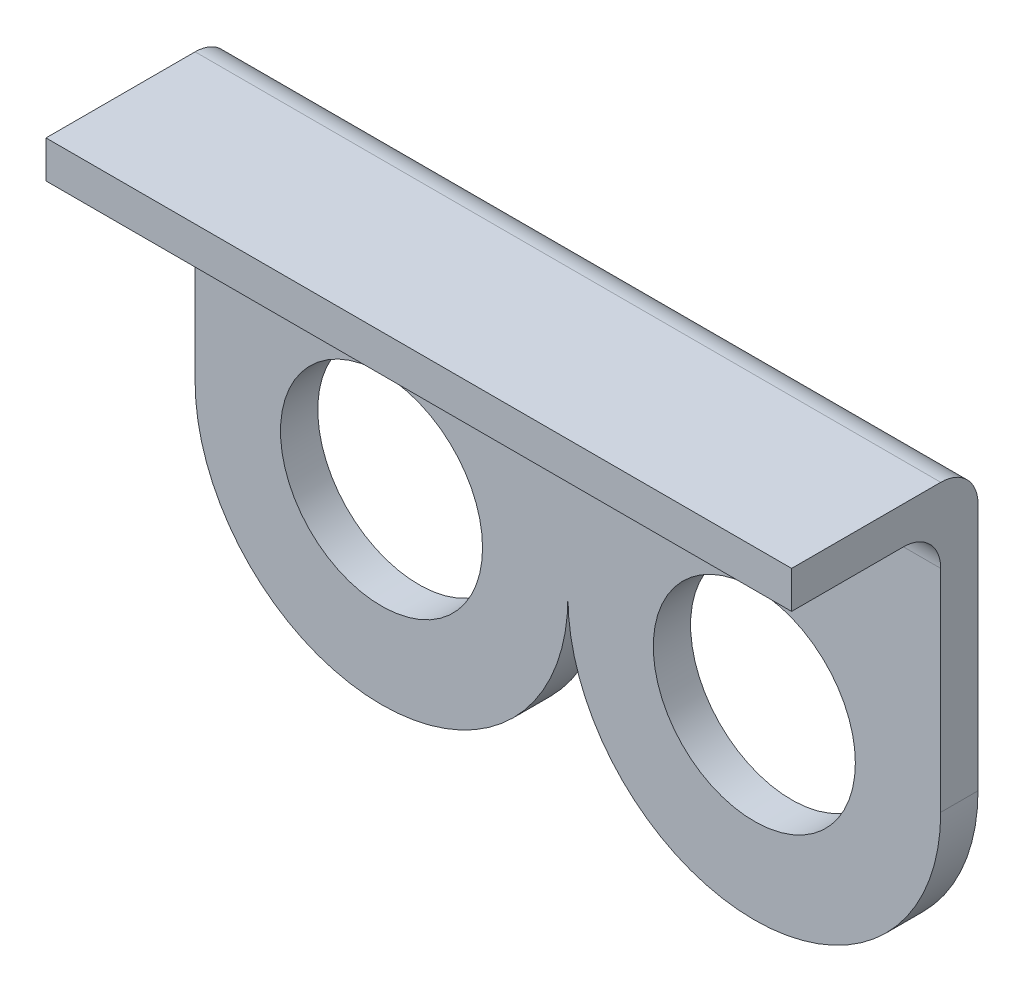
ISO-10303-21;
HEADER;
FILE_DESCRIPTION(('STEP AP214'),'2;1');
FILE_NAME('part.step','',(''),(''),'','','');
FILE_SCHEMA(('AUTOMOTIVE_DESIGN { 1 0 10303 214 1 1 1 1 }'));
ENDSEC;
DATA;
#1=APPLICATION_CONTEXT('core data for automotive mechanical design processes');
#2=APPLICATION_PROTOCOL_DEFINITION('international standard','automotive_design',2000,#1);
#3=PRODUCT_CONTEXT('',#1,'mechanical');
#4=PRODUCT('Part','Part','',(#3));
#5=PRODUCT_RELATED_PRODUCT_CATEGORY('part','',(#4));
#6=PRODUCT_DEFINITION_FORMATION('','',#4);
#7=PRODUCT_DEFINITION_CONTEXT('part definition',#1,'design');
#8=PRODUCT_DEFINITION('design','',#6,#7);
#9=PRODUCT_DEFINITION_SHAPE('','',#8);
#10=(LENGTH_UNIT() NAMED_UNIT(*) SI_UNIT(.MILLI.,.METRE.));
#11=(NAMED_UNIT(*) PLANE_ANGLE_UNIT() SI_UNIT($,.RADIAN.));
#12=(NAMED_UNIT(*) SI_UNIT($,.STERADIAN.) SOLID_ANGLE_UNIT());
#13=UNCERTAINTY_MEASURE_WITH_UNIT(LENGTH_MEASURE(1.E-05),#10,'distance_accuracy_value','');
#14=(GEOMETRIC_REPRESENTATION_CONTEXT(3) GLOBAL_UNCERTAINTY_ASSIGNED_CONTEXT((#13)) GLOBAL_UNIT_ASSIGNED_CONTEXT((#10,
#11,#12)) REPRESENTATION_CONTEXT('',''));
#15=CARTESIAN_POINT('',(0.,0.,0.));
#16=DIRECTION('',(0.,0.,1.));
#17=DIRECTION('',(1.,0.,0.));
#18=AXIS2_PLACEMENT_3D('',#15,#16,#17);
#19=CARTESIAN_POINT('',(-30.,20.5,15.));
#20=DIRECTION('',(0.,1.,0.));
#21=DIRECTION('',(0.,0.,1.));
#22=AXIS2_PLACEMENT_3D('',#19,#20,#21);
#23=PLANE('',#22);
#24=DIRECTION('',(0.,0.,-1.));
#25=VECTOR('',#24,1.);
#26=CARTESIAN_POINT('',(30.,20.5,15.));
#27=LINE('',#26,#25);
#28=CARTESIAN_POINT('',(30.,20.5,15.));
#29=VERTEX_POINT('',#28);
#30=CARTESIAN_POINT('',(30.,20.5,3.));
#31=VERTEX_POINT('',#30);
#32=EDGE_CURVE('E187',#29,#31,#27,.T.);
#33=ORIENTED_EDGE('',*,*,#32,.T.);
#34=DIRECTION('',(1.,0.,0.));
#35=VECTOR('',#34,1.);
#36=CARTESIAN_POINT('',(-30.,20.5,3.));
#37=LINE('',#36,#35);
#38=CARTESIAN_POINT('',(-30.,20.5,3.));
#39=VERTEX_POINT('',#38);
#40=EDGE_CURVE('E48',#31,#39,#37,.F.);
#41=ORIENTED_EDGE('',*,*,#40,.T.);
#42=DIRECTION('',(0.,0.,-1.));
#43=VECTOR('',#42,1.);
#44=CARTESIAN_POINT('',(-30.,20.5,15.));
#45=LINE('',#44,#43);
#46=CARTESIAN_POINT('',(-30.,20.5,15.));
#47=VERTEX_POINT('',#46);
#48=EDGE_CURVE('E193',#47,#39,#45,.T.);
#49=ORIENTED_EDGE('',*,*,#48,.F.);
#50=DIRECTION('',(1.,0.,0.));
#51=VECTOR('',#50,1.);
#52=CARTESIAN_POINT('',(-30.,20.5,15.));
#53=LINE('',#52,#51);
#54=EDGE_CURVE('E172',#47,#29,#53,.T.);
#55=ORIENTED_EDGE('',*,*,#54,.T.);
#56=EDGE_LOOP('',(#33,#41,#49,#55));
#57=FACE_BOUND('',#56,.T.);
#58=ADVANCED_FACE('F39',(#57),#23,.T.);
#59=CARTESIAN_POINT('',(-30.,17.5,15.));
#60=DIRECTION('',(-1.,0.,0.));
#61=DIRECTION('',(0.,0.,1.));
#62=AXIS2_PLACEMENT_3D('',#59,#60,#61);
#63=PLANE('',#62);
#64=ORIENTED_EDGE('',*,*,#48,.T.);
#65=CARTESIAN_POINT('',(-30.,17.5,3.));
#66=DIRECTION('',(-1.,0.,0.));
#67=DIRECTION('',(0.,0.,1.));
#68=AXIS2_PLACEMENT_3D('',#65,#66,#67);
#69=CIRCLE('',#68,3.);
#70=CARTESIAN_POINT('',(-30.,17.5,0.));
#71=VERTEX_POINT('',#70);
#72=EDGE_CURVE('E11',#39,#71,#69,.T.);
#73=ORIENTED_EDGE('',*,*,#72,.T.);
#74=DIRECTION('',(0.,1.,0.));
#75=VECTOR('',#74,1.);
#76=CARTESIAN_POINT('',(-30.,17.5,0.));
#77=LINE('',#76,#75);
#78=CARTESIAN_POINT('',(-30.,-2.50000000000001,0.));
#79=VERTEX_POINT('',#78);
#80=EDGE_CURVE('E177',#79,#71,#77,.T.);
#81=ORIENTED_EDGE('',*,*,#80,.F.);
#82=DIRECTION('',(0.,0.,-1.));
#83=VECTOR('',#82,1.);
#84=CARTESIAN_POINT('',(-30.,-2.50000000000001,3.));
#85=LINE('',#84,#83);
#86=CARTESIAN_POINT('',(-30.,-2.50000000000001,3.));
#87=VERTEX_POINT('',#86);
#88=EDGE_CURVE('E130',#87,#79,#85,.T.);
#89=ORIENTED_EDGE('',*,*,#88,.F.);
#90=DIRECTION('',(0.,-1.,0.));
#91=VECTOR('',#90,1.);
#92=CARTESIAN_POINT('',(-30.,0.,3.));
#93=LINE('',#92,#91);
#94=CARTESIAN_POINT('',(-30.,14.5,3.));
#95=VERTEX_POINT('',#94);
#96=EDGE_CURVE('E120',#95,#87,#93,.T.);
#97=ORIENTED_EDGE('',*,*,#96,.F.);
#98=CARTESIAN_POINT('',(-30.,14.5,6.));
#99=DIRECTION('',(-1.,0.,0.));
#100=DIRECTION('',(0.,0.,1.));
#101=AXIS2_PLACEMENT_3D('',#98,#99,#100);
#102=CIRCLE('',#101,3.);
#103=CARTESIAN_POINT('',(-30.,17.5,6.));
#104=VERTEX_POINT('',#103);
#105=EDGE_CURVE('E214',#95,#104,#102,.F.);
#106=ORIENTED_EDGE('',*,*,#105,.T.);
#107=DIRECTION('',(0.,0.,-1.));
#108=VECTOR('',#107,1.);
#109=CARTESIAN_POINT('',(-30.,17.5,15.));
#110=LINE('',#109,#108);
#111=CARTESIAN_POINT('',(-30.,17.5,15.));
#112=VERTEX_POINT('',#111);
#113=EDGE_CURVE('E197',#112,#104,#110,.T.);
#114=ORIENTED_EDGE('',*,*,#113,.F.);
#115=DIRECTION('',(0.,1.,0.));
#116=VECTOR('',#115,1.);
#117=CARTESIAN_POINT('',(-30.,17.5,15.));
#118=LINE('',#117,#116);
#119=EDGE_CURVE('E183',#112,#47,#118,.T.);
#120=ORIENTED_EDGE('',*,*,#119,.T.);
#121=EDGE_LOOP('',(#64,#73,#81,#89,#97,#106,#114,#120));
#122=FACE_BOUND('',#121,.T.);
#123=ADVANCED_FACE('F231',(#122),#63,.T.);
#124=CARTESIAN_POINT('',(-30.,17.5,15.));
#125=DIRECTION('',(0.,1.,0.));
#126=DIRECTION('',(0.,0.,1.));
#127=AXIS2_PLACEMENT_3D('',#124,#125,#126);
#128=PLANE('',#127);
#129=ORIENTED_EDGE('',*,*,#113,.T.);
#130=DIRECTION('',(1.,0.,0.));
#131=VECTOR('',#130,1.);
#132=CARTESIAN_POINT('',(-30.,17.5,6.));
#133=LINE('',#132,#131);
#134=CARTESIAN_POINT('',(30.,17.5,6.));
#135=VERTEX_POINT('',#134);
#136=EDGE_CURVE('E196',#104,#135,#133,.T.);
#137=ORIENTED_EDGE('',*,*,#136,.T.);
#138=DIRECTION('',(0.,0.,-1.));
#139=VECTOR('',#138,1.);
#140=CARTESIAN_POINT('',(30.,17.5,15.));
#141=LINE('',#140,#139);
#142=CARTESIAN_POINT('',(30.,17.5,15.));
#143=VERTEX_POINT('',#142);
#144=EDGE_CURVE('E201',#143,#135,#141,.T.);
#145=ORIENTED_EDGE('',*,*,#144,.F.);
#146=DIRECTION('',(1.,0.,0.));
#147=VECTOR('',#146,1.);
#148=CARTESIAN_POINT('',(-30.,17.5,15.));
#149=LINE('',#148,#147);
#150=EDGE_CURVE('E180',#112,#143,#149,.T.);
#151=ORIENTED_EDGE('',*,*,#150,.F.);
#152=EDGE_LOOP('',(#129,#137,#145,#151));
#153=FACE_BOUND('',#152,.T.);
#154=ADVANCED_FACE('F241',(#153),#128,.F.);
#155=CARTESIAN_POINT('',(30.,17.5,15.));
#156=DIRECTION('',(-1.,0.,0.));
#157=DIRECTION('',(0.,0.,1.));
#158=AXIS2_PLACEMENT_3D('',#155,#156,#157);
#159=PLANE('',#158);
#160=DIRECTION('',(0.,1.,0.));
#161=VECTOR('',#160,1.);
#162=CARTESIAN_POINT('',(30.,17.5,0.));
#163=LINE('',#162,#161);
#164=CARTESIAN_POINT('',(30.,-2.5,0.));
#165=VERTEX_POINT('',#164);
#166=CARTESIAN_POINT('',(30.,17.5,0.));
#167=VERTEX_POINT('',#166);
#168=EDGE_CURVE('E129',#165,#167,#163,.T.);
#169=ORIENTED_EDGE('',*,*,#168,.T.);
#170=CARTESIAN_POINT('',(30.,17.5,3.));
#171=DIRECTION('',(-1.,0.,0.));
#172=DIRECTION('',(0.,0.,1.));
#173=AXIS2_PLACEMENT_3D('',#170,#171,#172);
#174=CIRCLE('',#173,3.);
#175=EDGE_CURVE('E62',#167,#31,#174,.F.);
#176=ORIENTED_EDGE('',*,*,#175,.T.);
#177=ORIENTED_EDGE('',*,*,#32,.F.);
#178=DIRECTION('',(0.,1.,0.));
#179=VECTOR('',#178,1.);
#180=CARTESIAN_POINT('',(30.,17.5,15.));
#181=LINE('',#180,#179);
#182=EDGE_CURVE('E176',#143,#29,#181,.T.);
#183=ORIENTED_EDGE('',*,*,#182,.F.);
#184=ORIENTED_EDGE('',*,*,#144,.T.);
#185=CARTESIAN_POINT('',(30.,14.5,6.));
#186=DIRECTION('',(-1.,0.,0.));
#187=DIRECTION('',(0.,0.,1.));
#188=AXIS2_PLACEMENT_3D('',#185,#186,#187);
#189=CIRCLE('',#188,3.);
#190=CARTESIAN_POINT('',(30.,14.5,3.));
#191=VERTEX_POINT('',#190);
#192=EDGE_CURVE('E115',#135,#191,#189,.T.);
#193=ORIENTED_EDGE('',*,*,#192,.T.);
#194=DIRECTION('',(0.,-1.,0.));
#195=VECTOR('',#194,1.);
#196=CARTESIAN_POINT('',(30.,0.,3.));
#197=LINE('',#196,#195);
#198=CARTESIAN_POINT('',(30.,-2.5,3.));
#199=VERTEX_POINT('',#198);
#200=EDGE_CURVE('E109',#191,#199,#197,.T.);
#201=ORIENTED_EDGE('',*,*,#200,.T.);
#202=DIRECTION('',(0.,0.,-1.));
#203=VECTOR('',#202,1.);
#204=CARTESIAN_POINT('',(30.,-2.5,3.));
#205=LINE('',#204,#203);
#206=EDGE_CURVE('E112',#199,#165,#205,.T.);
#207=ORIENTED_EDGE('',*,*,#206,.T.);
#208=EDGE_LOOP('',(#169,#176,#177,#183,#184,#193,#201,#207));
#209=FACE_BOUND('',#208,.T.);
#210=ADVANCED_FACE('F111',(#209),#159,.F.);
#211=CARTESIAN_POINT('',(0.,0.,15.));
#212=DIRECTION('',(0.,0.,1.));
#213=DIRECTION('',(1.,0.,0.));
#214=AXIS2_PLACEMENT_3D('',#211,#212,#213);
#215=PLANE('',#214);
#216=ORIENTED_EDGE('',*,*,#54,.F.);
#217=ORIENTED_EDGE('',*,*,#119,.F.);
#218=ORIENTED_EDGE('',*,*,#150,.T.);
#219=ORIENTED_EDGE('',*,*,#182,.T.);
#220=EDGE_LOOP('',(#216,#217,#218,#219));
#221=FACE_BOUND('',#220,.T.);
#222=ADVANCED_FACE('F236',(#221),#215,.T.);
#223=CARTESIAN_POINT('',(0.,0.,0.));
#224=DIRECTION('',(0.,0.,1.));
#225=DIRECTION('',(1.,0.,0.));
#226=AXIS2_PLACEMENT_3D('',#223,#224,#225);
#227=PLANE('',#226);
#228=ORIENTED_EDGE('',*,*,#80,.T.);
#229=DIRECTION('',(1.,0.,0.));
#230=VECTOR('',#229,1.);
#231=CARTESIAN_POINT('',(30.,17.5,0.));
#232=LINE('',#231,#230);
#233=EDGE_CURVE('E217',#71,#167,#232,.T.);
#234=ORIENTED_EDGE('',*,*,#233,.T.);
#235=ORIENTED_EDGE('',*,*,#168,.F.);
#236=CARTESIAN_POINT('',(15.,-2.50000000000001,0.));
#237=DIRECTION('',(0.,0.,1.));
#238=DIRECTION('',(1.,0.,0.));
#239=AXIS2_PLACEMENT_3D('',#236,#237,#238);
#240=CIRCLE('',#239,15.);
#241=CARTESIAN_POINT('',(0.,-2.50000000000001,0.));
#242=VERTEX_POINT('',#241);
#243=EDGE_CURVE('E127',#165,#242,#240,.F.);
#244=ORIENTED_EDGE('',*,*,#243,.T.);
#245=CARTESIAN_POINT('',(-15.,-2.50000000000001,0.));
#246=DIRECTION('',(0.,0.,1.));
#247=DIRECTION('',(1.,0.,0.));
#248=AXIS2_PLACEMENT_3D('',#245,#246,#247);
#249=CIRCLE('',#248,15.);
#250=EDGE_CURVE('E160',#79,#242,#249,.T.);
#251=ORIENTED_EDGE('',*,*,#250,.F.);
#252=EDGE_LOOP('',(#228,#234,#235,#244,#251));
#253=FACE_BOUND('',#252,.T.);
#254=CARTESIAN_POINT('',(-15.,-2.50000000000001,0.));
#255=DIRECTION('',(0.,0.,1.));
#256=DIRECTION('',(1.,0.,0.));
#257=AXIS2_PLACEMENT_3D('',#254,#255,#256);
#258=CIRCLE('',#257,8.13);
#259=CARTESIAN_POINT('',(-6.87,-2.50000000000001,0.));
#260=VERTEX_POINT('',#259);
#261=EDGE_CURVE('E142',#260,#260,#258,.T.);
#262=ORIENTED_EDGE('',*,*,#261,.T.);
#263=EDGE_LOOP('',(#262));
#264=FACE_BOUND('',#263,.T.);
#265=CARTESIAN_POINT('',(15.,-2.50000000000001,0.));
#266=DIRECTION('',(0.,0.,1.));
#267=DIRECTION('',(1.,0.,0.));
#268=AXIS2_PLACEMENT_3D('',#265,#266,#267);
#269=CIRCLE('',#268,8.13);
#270=CARTESIAN_POINT('',(23.13,-2.50000000000001,0.));
#271=VERTEX_POINT('',#270);
#272=EDGE_CURVE('E138',#271,#271,#269,.F.);
#273=ORIENTED_EDGE('',*,*,#272,.F.);
#274=EDGE_LOOP('',(#273));
#275=FACE_BOUND('',#274,.T.);
#276=ADVANCED_FACE('F225',(#253,#264,#275),#227,.F.);
#277=CARTESIAN_POINT('',(15.,-2.50000000000001,3.));
#278=DIRECTION('',(0.,0.,-1.));
#279=DIRECTION('',(-1.,0.,0.));
#280=AXIS2_PLACEMENT_3D('',#277,#278,#279);
#281=CYLINDRICAL_SURFACE('',#280,15.);
#282=ORIENTED_EDGE('',*,*,#243,.F.);
#283=ORIENTED_EDGE('',*,*,#206,.F.);
#284=CARTESIAN_POINT('',(15.,-2.50000000000001,3.));
#285=DIRECTION('',(0.,0.,1.));
#286=DIRECTION('',(1.,0.,0.));
#287=AXIS2_PLACEMENT_3D('',#284,#285,#286);
#288=CIRCLE('',#287,15.);
#289=CARTESIAN_POINT('',(0.,-2.50000000000001,3.));
#290=VERTEX_POINT('',#289);
#291=EDGE_CURVE('E121',#199,#290,#288,.F.);
#292=ORIENTED_EDGE('',*,*,#291,.T.);
#293=DIRECTION('',(0.,0.,-1.));
#294=VECTOR('',#293,1.);
#295=CARTESIAN_POINT('',(0.,-2.50000000000001,3.));
#296=LINE('',#295,#294);
#297=EDGE_CURVE('E157',#290,#242,#296,.T.);
#298=ORIENTED_EDGE('',*,*,#297,.T.);
#299=EDGE_LOOP('',(#282,#283,#292,#298));
#300=FACE_BOUND('',#299,.T.);
#301=ADVANCED_FACE('F125',(#300),#281,.T.);
#302=CARTESIAN_POINT('',(-15.,-2.50000000000001,3.));
#303=DIRECTION('',(0.,0.,-1.));
#304=DIRECTION('',(-1.,0.,0.));
#305=AXIS2_PLACEMENT_3D('',#302,#303,#304);
#306=CYLINDRICAL_SURFACE('',#305,8.13);
#307=CARTESIAN_POINT('',(-15.,-2.50000000000001,3.));
#308=DIRECTION('',(0.,0.,1.));
#309=DIRECTION('',(1.,0.,0.));
#310=AXIS2_PLACEMENT_3D('',#307,#308,#309);
#311=CIRCLE('',#310,8.13);
#312=CARTESIAN_POINT('',(-6.87,-2.50000000000001,3.));
#313=VERTEX_POINT('',#312);
#314=EDGE_CURVE('E149',#313,#313,#311,.T.);
#315=ORIENTED_EDGE('',*,*,#314,.T.);
#316=EDGE_LOOP('',(#315));
#317=FACE_BOUND('',#316,.T.);
#318=ORIENTED_EDGE('',*,*,#261,.F.);
#319=EDGE_LOOP('',(#318));
#320=FACE_BOUND('',#319,.T.);
#321=ADVANCED_FACE('F251',(#317,#320),#306,.F.);
#322=CARTESIAN_POINT('',(-15.,-2.50000000000001,3.));
#323=DIRECTION('',(0.,0.,-1.));
#324=DIRECTION('',(-1.,0.,0.));
#325=AXIS2_PLACEMENT_3D('',#322,#323,#324);
#326=CYLINDRICAL_SURFACE('',#325,15.);
#327=ORIENTED_EDGE('',*,*,#250,.T.);
#328=ORIENTED_EDGE('',*,*,#297,.F.);
#329=CARTESIAN_POINT('',(-15.,-2.50000000000001,3.));
#330=DIRECTION('',(0.,0.,1.));
#331=DIRECTION('',(1.,0.,0.));
#332=AXIS2_PLACEMENT_3D('',#329,#330,#331);
#333=CIRCLE('',#332,15.);
#334=EDGE_CURVE('E135',#87,#290,#333,.T.);
#335=ORIENTED_EDGE('',*,*,#334,.F.);
#336=ORIENTED_EDGE('',*,*,#88,.T.);
#337=EDGE_LOOP('',(#327,#328,#335,#336));
#338=FACE_BOUND('',#337,.T.);
#339=ADVANCED_FACE('F248',(#338),#326,.T.);
#340=CARTESIAN_POINT('',(15.,-2.50000000000001,3.));
#341=DIRECTION('',(0.,0.,-1.));
#342=DIRECTION('',(-1.,0.,0.));
#343=AXIS2_PLACEMENT_3D('',#340,#341,#342);
#344=CYLINDRICAL_SURFACE('',#343,8.13);
#345=CARTESIAN_POINT('',(15.,-2.50000000000001,3.));
#346=DIRECTION('',(0.,0.,1.));
#347=DIRECTION('',(1.,0.,0.));
#348=AXIS2_PLACEMENT_3D('',#345,#346,#347);
#349=CIRCLE('',#348,8.13);
#350=CARTESIAN_POINT('',(23.13,-2.50000000000001,3.));
#351=VERTEX_POINT('',#350);
#352=EDGE_CURVE('E153',#351,#351,#349,.F.);
#353=ORIENTED_EDGE('',*,*,#352,.F.);
#354=EDGE_LOOP('',(#353));
#355=FACE_BOUND('',#354,.T.);
#356=ORIENTED_EDGE('',*,*,#272,.T.);
#357=EDGE_LOOP('',(#356));
#358=FACE_BOUND('',#357,.T.);
#359=ADVANCED_FACE('F250',(#355,#358),#344,.F.);
#360=CARTESIAN_POINT('',(0.,0.,3.));
#361=DIRECTION('',(0.,0.,1.));
#362=DIRECTION('',(1.,0.,0.));
#363=AXIS2_PLACEMENT_3D('',#360,#361,#362);
#364=PLANE('',#363);
#365=ORIENTED_EDGE('',*,*,#200,.F.);
#366=DIRECTION('',(1.,0.,0.));
#367=VECTOR('',#366,1.);
#368=CARTESIAN_POINT('',(0.,14.5,3.));
#369=LINE('',#368,#367);
#370=EDGE_CURVE('E209',#191,#95,#369,.F.);
#371=ORIENTED_EDGE('',*,*,#370,.T.);
#372=ORIENTED_EDGE('',*,*,#96,.T.);
#373=ORIENTED_EDGE('',*,*,#334,.T.);
#374=ORIENTED_EDGE('',*,*,#291,.F.);
#375=EDGE_LOOP('',(#365,#371,#372,#373,#374));
#376=FACE_BOUND('',#375,.T.);
#377=ORIENTED_EDGE('',*,*,#314,.F.);
#378=EDGE_LOOP('',(#377));
#379=FACE_BOUND('',#378,.T.);
#380=ORIENTED_EDGE('',*,*,#352,.T.);
#381=EDGE_LOOP('',(#380));
#382=FACE_BOUND('',#381,.T.);
#383=ADVANCED_FACE('F132',(#376,#379,#382),#364,.T.);
#384=CARTESIAN_POINT('',(-30.,14.5,6.));
#385=DIRECTION('',(1.,0.,0.));
#386=DIRECTION('',(0.,0.,-1.));
#387=AXIS2_PLACEMENT_3D('',#384,#385,#386);
#388=CYLINDRICAL_SURFACE('',#387,3.);
#389=ORIENTED_EDGE('',*,*,#105,.F.);
#390=ORIENTED_EDGE('',*,*,#370,.F.);
#391=ORIENTED_EDGE('',*,*,#192,.F.);
#392=ORIENTED_EDGE('',*,*,#136,.F.);
#393=EDGE_LOOP('',(#389,#390,#391,#392));
#394=FACE_BOUND('',#393,.T.);
#395=ADVANCED_FACE('F245',(#394),#388,.F.);
#396=CARTESIAN_POINT('',(0.,17.5,3.));
#397=DIRECTION('',(-1.,0.,0.));
#398=DIRECTION('',(0.,0.,1.));
#399=AXIS2_PLACEMENT_3D('',#396,#397,#398);
#400=CYLINDRICAL_SURFACE('',#399,3.);
#401=ORIENTED_EDGE('',*,*,#72,.F.);
#402=ORIENTED_EDGE('',*,*,#40,.F.);
#403=ORIENTED_EDGE('',*,*,#175,.F.);
#404=ORIENTED_EDGE('',*,*,#233,.F.);
#405=EDGE_LOOP('',(#401,#402,#403,#404));
#406=FACE_BOUND('',#405,.T.);
#407=ADVANCED_FACE('F41',(#406),#400,.T.);
#408=CLOSED_SHELL('',(#58,#123,#154,#210,#222,#276,#301,#321,#339,#359,#383,#395,#407));
#409=MANIFOLD_SOLID_BREP('B2',#408);
#410=ADVANCED_BREP_SHAPE_REPRESENTATION('',(#18,#409),#14);
#411=SHAPE_DEFINITION_REPRESENTATION(#9,#410);
ENDSEC;
END-ISO-10303-21;
